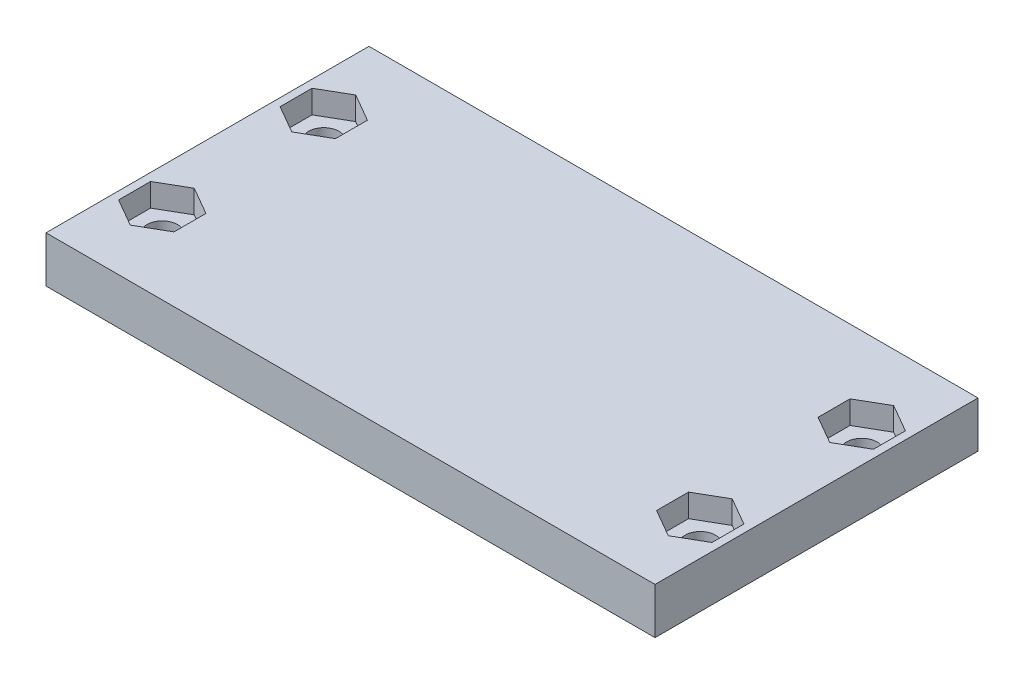
ISO-10303-21;
HEADER;
FILE_DESCRIPTION(('STEP AP214'),'2;1');
FILE_NAME('part.step','',(''),(''),'','','');
FILE_SCHEMA(('AUTOMOTIVE_DESIGN { 1 0 10303 214 1 1 1 1 }'));
ENDSEC;
DATA;
#1=APPLICATION_CONTEXT('core data for automotive mechanical design processes');
#2=APPLICATION_PROTOCOL_DEFINITION('international standard','automotive_design',2000,#1);
#3=PRODUCT_CONTEXT('',#1,'mechanical');
#4=PRODUCT('Part','Part','',(#3));
#5=PRODUCT_RELATED_PRODUCT_CATEGORY('part','',(#4));
#6=PRODUCT_DEFINITION_FORMATION('','',#4);
#7=PRODUCT_DEFINITION_CONTEXT('part definition',#1,'design');
#8=PRODUCT_DEFINITION('design','',#6,#7);
#9=PRODUCT_DEFINITION_SHAPE('','',#8);
#10=(LENGTH_UNIT() NAMED_UNIT(*) SI_UNIT(.MILLI.,.METRE.));
#11=(NAMED_UNIT(*) PLANE_ANGLE_UNIT() SI_UNIT($,.RADIAN.));
#12=(NAMED_UNIT(*) SI_UNIT($,.STERADIAN.) SOLID_ANGLE_UNIT());
#13=UNCERTAINTY_MEASURE_WITH_UNIT(LENGTH_MEASURE(1.E-05),#10,'distance_accuracy_value','');
#14=(GEOMETRIC_REPRESENTATION_CONTEXT(3) GLOBAL_UNCERTAINTY_ASSIGNED_CONTEXT((#13)) GLOBAL_UNIT_ASSIGNED_CONTEXT((#10,
#11,#12)) REPRESENTATION_CONTEXT('',''));
#15=CARTESIAN_POINT('',(0.,0.,0.));
#16=DIRECTION('',(0.,0.,1.));
#17=DIRECTION('',(1.,0.,0.));
#18=AXIS2_PLACEMENT_3D('',#15,#16,#17);
#19=CARTESIAN_POINT('',(0.,5.,0.));
#20=DIRECTION('',(1.,0.,0.));
#21=DIRECTION('',(0.,0.,-1.));
#22=AXIS2_PLACEMENT_3D('',#19,#20,#21);
#23=PLANE('',#22);
#24=DIRECTION('',(0.,0.,1.));
#25=VECTOR('',#24,1.);
#26=CARTESIAN_POINT('',(0.,0.,0.));
#27=LINE('',#26,#25);
#28=CARTESIAN_POINT('',(0.,0.,-35.));
#29=VERTEX_POINT('',#28);
#30=CARTESIAN_POINT('',(0.,0.,0.));
#31=VERTEX_POINT('',#30);
#32=EDGE_CURVE('E409',#29,#31,#27,.T.);
#33=ORIENTED_EDGE('',*,*,#32,.T.);
#34=DIRECTION('',(0.,-1.,0.));
#35=VECTOR('',#34,1.);
#36=CARTESIAN_POINT('',(0.,5.,0.));
#37=LINE('',#36,#35);
#38=CARTESIAN_POINT('',(0.,5.,0.));
#39=VERTEX_POINT('',#38);
#40=EDGE_CURVE('E11',#39,#31,#37,.T.);
#41=ORIENTED_EDGE('',*,*,#40,.F.);
#42=DIRECTION('',(0.,0.,1.));
#43=VECTOR('',#42,1.);
#44=CARTESIAN_POINT('',(0.,5.,0.));
#45=LINE('',#44,#43);
#46=CARTESIAN_POINT('',(0.,5.,-35.));
#47=VERTEX_POINT('',#46);
#48=EDGE_CURVE('E420',#47,#39,#45,.T.);
#49=ORIENTED_EDGE('',*,*,#48,.F.);
#50=DIRECTION('',(0.,-1.,0.));
#51=VECTOR('',#50,1.);
#52=CARTESIAN_POINT('',(0.,5.,-35.));
#53=LINE('',#52,#51);
#54=EDGE_CURVE('E430',#47,#29,#53,.T.);
#55=ORIENTED_EDGE('',*,*,#54,.T.);
#56=EDGE_LOOP('',(#33,#41,#49,#55));
#57=FACE_BOUND('',#56,.T.);
#58=ADVANCED_FACE('F32',(#57),#23,.F.);
#59=CARTESIAN_POINT('',(0.,5.,0.));
#60=DIRECTION('',(0.,0.,-1.));
#61=DIRECTION('',(-1.,0.,0.));
#62=AXIS2_PLACEMENT_3D('',#59,#60,#61);
#63=PLANE('',#62);
#64=DIRECTION('',(1.,0.,0.));
#65=VECTOR('',#64,1.);
#66=CARTESIAN_POINT('',(0.,0.,0.));
#67=LINE('',#66,#65);
#68=CARTESIAN_POINT('',(66.,0.,0.));
#69=VERTEX_POINT('',#68);
#70=EDGE_CURVE('E433',#31,#69,#67,.T.);
#71=ORIENTED_EDGE('',*,*,#70,.T.);
#72=DIRECTION('',(0.,-1.,0.));
#73=VECTOR('',#72,1.);
#74=CARTESIAN_POINT('',(66.,5.,0.));
#75=LINE('',#74,#73);
#76=CARTESIAN_POINT('',(66.,5.,0.));
#77=VERTEX_POINT('',#76);
#78=EDGE_CURVE('E40',#77,#69,#75,.T.);
#79=ORIENTED_EDGE('',*,*,#78,.F.);
#80=DIRECTION('',(1.,0.,0.));
#81=VECTOR('',#80,1.);
#82=CARTESIAN_POINT('',(0.,5.,0.));
#83=LINE('',#82,#81);
#84=EDGE_CURVE('E423',#39,#77,#83,.T.);
#85=ORIENTED_EDGE('',*,*,#84,.F.);
#86=ORIENTED_EDGE('',*,*,#40,.T.);
#87=EDGE_LOOP('',(#71,#79,#85,#86));
#88=FACE_BOUND('',#87,.T.);
#89=ADVANCED_FACE('F474',(#88),#63,.F.);
#90=CARTESIAN_POINT('',(66.,5.,0.));
#91=DIRECTION('',(-1.,0.,0.));
#92=DIRECTION('',(0.,0.,1.));
#93=AXIS2_PLACEMENT_3D('',#90,#91,#92);
#94=PLANE('',#93);
#95=DIRECTION('',(0.,0.,-1.));
#96=VECTOR('',#95,1.);
#97=CARTESIAN_POINT('',(66.,0.,0.));
#98=LINE('',#97,#96);
#99=CARTESIAN_POINT('',(66.,0.,-35.));
#100=VERTEX_POINT('',#99);
#101=EDGE_CURVE('E435',#69,#100,#98,.T.);
#102=ORIENTED_EDGE('',*,*,#101,.T.);
#103=DIRECTION('',(0.,-1.,0.));
#104=VECTOR('',#103,1.);
#105=CARTESIAN_POINT('',(66.,5.,-35.));
#106=LINE('',#105,#104);
#107=CARTESIAN_POINT('',(66.,5.,-35.));
#108=VERTEX_POINT('',#107);
#109=EDGE_CURVE('E440',#108,#100,#106,.T.);
#110=ORIENTED_EDGE('',*,*,#109,.F.);
#111=DIRECTION('',(0.,0.,-1.));
#112=VECTOR('',#111,1.);
#113=CARTESIAN_POINT('',(66.,5.,0.));
#114=LINE('',#113,#112);
#115=EDGE_CURVE('E426',#77,#108,#114,.T.);
#116=ORIENTED_EDGE('',*,*,#115,.F.);
#117=ORIENTED_EDGE('',*,*,#78,.T.);
#118=EDGE_LOOP('',(#102,#110,#116,#117));
#119=FACE_BOUND('',#118,.T.);
#120=ADVANCED_FACE('F479',(#119),#94,.F.);
#121=CARTESIAN_POINT('',(0.,5.,-35.));
#122=DIRECTION('',(0.,0.,1.));
#123=DIRECTION('',(1.,0.,0.));
#124=AXIS2_PLACEMENT_3D('',#121,#122,#123);
#125=PLANE('',#124);
#126=DIRECTION('',(-1.,0.,0.));
#127=VECTOR('',#126,1.);
#128=CARTESIAN_POINT('',(0.,0.,-35.));
#129=LINE('',#128,#127);
#130=EDGE_CURVE('E424',#100,#29,#129,.T.);
#131=ORIENTED_EDGE('',*,*,#130,.T.);
#132=ORIENTED_EDGE('',*,*,#54,.F.);
#133=DIRECTION('',(-1.,0.,0.));
#134=VECTOR('',#133,1.);
#135=CARTESIAN_POINT('',(0.,5.,-35.));
#136=LINE('',#135,#134);
#137=EDGE_CURVE('E428',#108,#47,#136,.T.);
#138=ORIENTED_EDGE('',*,*,#137,.F.);
#139=ORIENTED_EDGE('',*,*,#109,.T.);
#140=EDGE_LOOP('',(#131,#132,#138,#139));
#141=FACE_BOUND('',#140,.T.);
#142=ADVANCED_FACE('F496',(#141),#125,.F.);
#143=CARTESIAN_POINT('',(0.,5.,0.));
#144=DIRECTION('',(0.,-1.,0.));
#145=DIRECTION('',(0.,0.,-1.));
#146=AXIS2_PLACEMENT_3D('',#143,#144,#145);
#147=PLANE('',#146);
#148=DIRECTION('',(0.866025403784439,0.,0.5));
#149=VECTOR('',#148,1.);
#150=CARTESIAN_POINT('',(62.15,5.,-22.7858983848623));
#151=LINE('',#150,#149);
#152=CARTESIAN_POINT('',(59.15,5.,-24.5179491924311));
#153=VERTEX_POINT('',#152);
#154=CARTESIAN_POINT('',(62.15,5.,-22.7858983848623));
#155=VERTEX_POINT('',#154);
#156=EDGE_CURVE('E348',#153,#155,#151,.T.);
#157=ORIENTED_EDGE('',*,*,#156,.F.);
#158=DIRECTION('',(0.,0.,1.));
#159=VECTOR('',#158,1.);
#160=CARTESIAN_POINT('',(59.15,5.,-24.5179491924311));
#161=LINE('',#160,#159);
#162=CARTESIAN_POINT('',(59.15,5.,-27.9820508075689));
#163=VERTEX_POINT('',#162);
#164=EDGE_CURVE('E48',#163,#153,#161,.T.);
#165=ORIENTED_EDGE('',*,*,#164,.F.);
#166=DIRECTION('',(-0.866025403784439,0.,0.5));
#167=VECTOR('',#166,1.);
#168=CARTESIAN_POINT('',(59.15,5.,-27.9820508075689));
#169=LINE('',#168,#167);
#170=CARTESIAN_POINT('',(62.15,5.,-29.7141016151378));
#171=VERTEX_POINT('',#170);
#172=EDGE_CURVE('E331',#171,#163,#169,.T.);
#173=ORIENTED_EDGE('',*,*,#172,.F.);
#174=DIRECTION('',(-0.866025403784438,0.,-0.500000000000001));
#175=VECTOR('',#174,1.);
#176=CARTESIAN_POINT('',(62.15,5.,-29.7141016151378));
#177=LINE('',#176,#175);
#178=CARTESIAN_POINT('',(65.15,5.,-27.9820508075689));
#179=VERTEX_POINT('',#178);
#180=EDGE_CURVE('E357',#179,#171,#177,.T.);
#181=ORIENTED_EDGE('',*,*,#180,.F.);
#182=DIRECTION('',(0.,0.,-1.));
#183=VECTOR('',#182,1.);
#184=CARTESIAN_POINT('',(65.15,5.,-27.9820508075689));
#185=LINE('',#184,#183);
#186=CARTESIAN_POINT('',(65.15,5.,-24.5179491924311));
#187=VERTEX_POINT('',#186);
#188=EDGE_CURVE('E354',#187,#179,#185,.T.);
#189=ORIENTED_EDGE('',*,*,#188,.F.);
#190=DIRECTION('',(0.866025403784438,0.,-0.500000000000001));
#191=VECTOR('',#190,1.);
#192=CARTESIAN_POINT('',(65.15,5.,-24.5179491924311));
#193=LINE('',#192,#191);
#194=EDGE_CURVE('E351',#155,#187,#193,.T.);
#195=ORIENTED_EDGE('',*,*,#194,.F.);
#196=EDGE_LOOP('',(#157,#165,#173,#181,#189,#195));
#197=FACE_BOUND('',#196,.T.);
#198=DIRECTION('',(0.866025403784439,0.,-0.5));
#199=VECTOR('',#198,1.);
#200=CARTESIAN_POINT('',(3.85,5.,-5.28589838486225));
#201=LINE('',#200,#199);
#202=CARTESIAN_POINT('',(3.85,5.,-5.28589838486225));
#203=VERTEX_POINT('',#202);
#204=CARTESIAN_POINT('',(6.85,5.,-7.01794919243112));
#205=VERTEX_POINT('',#204);
#206=EDGE_CURVE('E302',#203,#205,#201,.T.);
#207=ORIENTED_EDGE('',*,*,#206,.F.);
#208=DIRECTION('',(0.866025403784438,0.,0.5));
#209=VECTOR('',#208,1.);
#210=CARTESIAN_POINT('',(0.850000000000004,5.,-7.01794919243112));
#211=LINE('',#210,#209);
#212=CARTESIAN_POINT('',(0.850000000000004,5.,-7.01794919243112));
#213=VERTEX_POINT('',#212);
#214=EDGE_CURVE('E56',#213,#203,#211,.T.);
#215=ORIENTED_EDGE('',*,*,#214,.F.);
#216=DIRECTION('',(0.,0.,1.));
#217=VECTOR('',#216,1.);
#218=CARTESIAN_POINT('',(0.850000000000004,5.,-10.4820508075689));
#219=LINE('',#218,#217);
#220=CARTESIAN_POINT('',(0.850000000000004,5.,-10.4820508075689));
#221=VERTEX_POINT('',#220);
#222=EDGE_CURVE('E285',#221,#213,#219,.T.);
#223=ORIENTED_EDGE('',*,*,#222,.F.);
#224=DIRECTION('',(-0.866025403784439,0.,0.5));
#225=VECTOR('',#224,1.);
#226=CARTESIAN_POINT('',(3.85,5.,-12.2141016151378));
#227=LINE('',#226,#225);
#228=CARTESIAN_POINT('',(3.85,5.,-12.2141016151378));
#229=VERTEX_POINT('',#228);
#230=EDGE_CURVE('E312',#229,#221,#227,.T.);
#231=ORIENTED_EDGE('',*,*,#230,.F.);
#232=DIRECTION('',(-0.866025403784439,0.,-0.5));
#233=VECTOR('',#232,1.);
#234=CARTESIAN_POINT('',(6.85,5.,-10.4820508075689));
#235=LINE('',#234,#233);
#236=CARTESIAN_POINT('',(6.85,5.,-10.4820508075689));
#237=VERTEX_POINT('',#236);
#238=EDGE_CURVE('E309',#237,#229,#235,.T.);
#239=ORIENTED_EDGE('',*,*,#238,.F.);
#240=DIRECTION('',(0.,0.,-1.));
#241=VECTOR('',#240,1.);
#242=CARTESIAN_POINT('',(6.85,5.,-7.01794919243112));
#243=LINE('',#242,#241);
#244=EDGE_CURVE('E306',#205,#237,#243,.T.);
#245=ORIENTED_EDGE('',*,*,#244,.F.);
#246=EDGE_LOOP('',(#207,#215,#223,#231,#239,#245));
#247=FACE_BOUND('',#246,.T.);
#248=DIRECTION('',(-0.866025403784438,0.,0.5));
#249=VECTOR('',#248,1.);
#250=CARTESIAN_POINT('',(3.84999999999999,5.,-29.7141016151378));
#251=LINE('',#250,#249);
#252=CARTESIAN_POINT('',(3.84999999999999,5.,-29.7141016151378));
#253=VERTEX_POINT('',#252);
#254=CARTESIAN_POINT('',(0.85,5.,-27.9820508075689));
#255=VERTEX_POINT('',#254);
#256=EDGE_CURVE('E260',#253,#255,#251,.T.);
#257=ORIENTED_EDGE('',*,*,#256,.F.);
#258=DIRECTION('',(-0.866025403784439,0.,-0.5));
#259=VECTOR('',#258,1.);
#260=CARTESIAN_POINT('',(6.85,5.,-27.9820508075689));
#261=LINE('',#260,#259);
#262=CARTESIAN_POINT('',(6.85,5.,-27.9820508075689));
#263=VERTEX_POINT('',#262);
#264=EDGE_CURVE('E225',#263,#253,#261,.T.);
#265=ORIENTED_EDGE('',*,*,#264,.F.);
#266=DIRECTION('',(0.,0.,-1.));
#267=VECTOR('',#266,1.);
#268=CARTESIAN_POINT('',(6.85,5.,-24.5179491924311));
#269=LINE('',#268,#267);
#270=CARTESIAN_POINT('',(6.85,5.,-24.5179491924311));
#271=VERTEX_POINT('',#270);
#272=EDGE_CURVE('E243',#271,#263,#269,.T.);
#273=ORIENTED_EDGE('',*,*,#272,.F.);
#274=DIRECTION('',(0.866025403784438,0.,-0.500000000000001));
#275=VECTOR('',#274,1.);
#276=CARTESIAN_POINT('',(3.85,5.,-22.7858983848623));
#277=LINE('',#276,#275);
#278=CARTESIAN_POINT('',(3.85,5.,-22.7858983848623));
#279=VERTEX_POINT('',#278);
#280=EDGE_CURVE('E246',#279,#271,#277,.T.);
#281=ORIENTED_EDGE('',*,*,#280,.F.);
#282=DIRECTION('',(0.866025403784439,0.,0.5));
#283=VECTOR('',#282,1.);
#284=CARTESIAN_POINT('',(0.850000000000001,5.,-24.5179491924311));
#285=LINE('',#284,#283);
#286=CARTESIAN_POINT('',(0.850000000000001,5.,-24.5179491924311));
#287=VERTEX_POINT('',#286);
#288=EDGE_CURVE('E266',#287,#279,#285,.T.);
#289=ORIENTED_EDGE('',*,*,#288,.F.);
#290=DIRECTION('',(0.,0.,1.));
#291=VECTOR('',#290,1.);
#292=CARTESIAN_POINT('',(0.85,5.,-27.9820508075689));
#293=LINE('',#292,#291);
#294=EDGE_CURVE('E263',#255,#287,#293,.T.);
#295=ORIENTED_EDGE('',*,*,#294,.F.);
#296=EDGE_LOOP('',(#257,#265,#273,#281,#289,#295));
#297=FACE_BOUND('',#296,.T.);
#298=DIRECTION('',(-0.866025403784438,0.,-0.500000000000001));
#299=VECTOR('',#298,1.);
#300=CARTESIAN_POINT('',(62.15,5.,-12.2141016151378));
#301=LINE('',#300,#299);
#302=CARTESIAN_POINT('',(65.15,5.,-10.4820508075689));
#303=VERTEX_POINT('',#302);
#304=CARTESIAN_POINT('',(62.15,5.,-12.2141016151378));
#305=VERTEX_POINT('',#304);
#306=EDGE_CURVE('E393',#303,#305,#301,.T.);
#307=ORIENTED_EDGE('',*,*,#306,.F.);
#308=DIRECTION('',(0.,0.,-1.));
#309=VECTOR('',#308,1.);
#310=CARTESIAN_POINT('',(65.15,5.,-10.4820508075689));
#311=LINE('',#310,#309);
#312=CARTESIAN_POINT('',(65.15,5.,-7.01794919243113));
#313=VERTEX_POINT('',#312);
#314=EDGE_CURVE('E273',#313,#303,#311,.T.);
#315=ORIENTED_EDGE('',*,*,#314,.F.);
#316=DIRECTION('',(0.866025403784438,0.,-0.500000000000002));
#317=VECTOR('',#316,1.);
#318=CARTESIAN_POINT('',(65.15,5.,-7.01794919243113));
#319=LINE('',#318,#317);
#320=CARTESIAN_POINT('',(62.15,5.,-5.28589838486225));
#321=VERTEX_POINT('',#320);
#322=EDGE_CURVE('E376',#321,#313,#319,.T.);
#323=ORIENTED_EDGE('',*,*,#322,.F.);
#324=DIRECTION('',(0.866025403784439,0.,0.5));
#325=VECTOR('',#324,1.);
#326=CARTESIAN_POINT('',(62.15,5.,-5.28589838486225));
#327=LINE('',#326,#325);
#328=CARTESIAN_POINT('',(59.15,5.,-7.01794919243113));
#329=VERTEX_POINT('',#328);
#330=EDGE_CURVE('E402',#329,#321,#327,.T.);
#331=ORIENTED_EDGE('',*,*,#330,.F.);
#332=DIRECTION('',(0.,0.,1.));
#333=VECTOR('',#332,1.);
#334=CARTESIAN_POINT('',(59.15,5.,-7.01794919243113));
#335=LINE('',#334,#333);
#336=CARTESIAN_POINT('',(59.15,5.,-10.4820508075689));
#337=VERTEX_POINT('',#336);
#338=EDGE_CURVE('E399',#337,#329,#335,.T.);
#339=ORIENTED_EDGE('',*,*,#338,.F.);
#340=DIRECTION('',(-0.866025403784439,0.,0.499999999999999));
#341=VECTOR('',#340,1.);
#342=CARTESIAN_POINT('',(59.15,5.,-10.4820508075689));
#343=LINE('',#342,#341);
#344=EDGE_CURVE('E396',#305,#337,#343,.T.);
#345=ORIENTED_EDGE('',*,*,#344,.F.);
#346=EDGE_LOOP('',(#307,#315,#323,#331,#339,#345));
#347=FACE_BOUND('',#346,.T.);
#348=ORIENTED_EDGE('',*,*,#48,.T.);
#349=ORIENTED_EDGE('',*,*,#84,.T.);
#350=ORIENTED_EDGE('',*,*,#115,.T.);
#351=ORIENTED_EDGE('',*,*,#137,.T.);
#352=EDGE_LOOP('',(#348,#349,#350,#351));
#353=FACE_BOUND('',#352,.T.);
#354=ADVANCED_FACE('F492',(#197,#247,#297,#347,#353),#147,.F.);
#355=CARTESIAN_POINT('',(0.,0.,0.));
#356=DIRECTION('',(0.,-1.,0.));
#357=DIRECTION('',(0.,0.,-1.));
#358=AXIS2_PLACEMENT_3D('',#355,#356,#357);
#359=PLANE('',#358);
#360=CARTESIAN_POINT('',(62.15,0.,-8.75));
#361=DIRECTION('',(0.,1.,0.));
#362=DIRECTION('',(0.,0.,1.));
#363=AXIS2_PLACEMENT_3D('',#360,#361,#362);
#364=CIRCLE('',#363,1.65000000000001);
#365=CARTESIAN_POINT('',(62.15,0.,-7.09999999999999));
#366=VERTEX_POINT('',#365);
#367=EDGE_CURVE('E632',#366,#366,#364,.T.);
#368=ORIENTED_EDGE('',*,*,#367,.T.);
#369=EDGE_LOOP('',(#368));
#370=FACE_BOUND('',#369,.T.);
#371=CARTESIAN_POINT('',(62.15,0.,-26.25));
#372=DIRECTION('',(0.,1.,0.));
#373=DIRECTION('',(0.,0.,1.));
#374=AXIS2_PLACEMENT_3D('',#371,#372,#373);
#375=CIRCLE('',#374,1.65000000000001);
#376=CARTESIAN_POINT('',(62.15,0.,-24.6));
#377=VERTEX_POINT('',#376);
#378=EDGE_CURVE('E627',#377,#377,#375,.T.);
#379=ORIENTED_EDGE('',*,*,#378,.T.);
#380=EDGE_LOOP('',(#379));
#381=FACE_BOUND('',#380,.T.);
#382=CARTESIAN_POINT('',(3.85,0.,-26.25));
#383=DIRECTION('',(0.,1.,0.));
#384=DIRECTION('',(0.,0.,1.));
#385=AXIS2_PLACEMENT_3D('',#382,#383,#384);
#386=CIRCLE('',#385,1.65);
#387=CARTESIAN_POINT('',(3.85,0.,-24.6));
#388=VERTEX_POINT('',#387);
#389=EDGE_CURVE('E625',#388,#388,#386,.T.);
#390=ORIENTED_EDGE('',*,*,#389,.T.);
#391=EDGE_LOOP('',(#390));
#392=FACE_BOUND('',#391,.T.);
#393=CARTESIAN_POINT('',(3.85,0.,-8.75));
#394=DIRECTION('',(0.,1.,0.));
#395=DIRECTION('',(0.,0.,1.));
#396=AXIS2_PLACEMENT_3D('',#393,#394,#395);
#397=CIRCLE('',#396,1.65);
#398=CARTESIAN_POINT('',(3.85,0.,-7.1));
#399=VERTEX_POINT('',#398);
#400=EDGE_CURVE('E249',#399,#399,#397,.T.);
#401=ORIENTED_EDGE('',*,*,#400,.T.);
#402=EDGE_LOOP('',(#401));
#403=FACE_BOUND('',#402,.T.);
#404=ORIENTED_EDGE('',*,*,#32,.F.);
#405=ORIENTED_EDGE('',*,*,#130,.F.);
#406=ORIENTED_EDGE('',*,*,#101,.F.);
#407=ORIENTED_EDGE('',*,*,#70,.F.);
#408=EDGE_LOOP('',(#404,#405,#406,#407));
#409=FACE_BOUND('',#408,.T.);
#410=ADVANCED_FACE('F487',(#370,#381,#392,#403,#409),#359,.T.);
#411=CARTESIAN_POINT('',(65.15,2.5,-10.4820508075689));
#412=DIRECTION('',(1.,0.,0.));
#413=DIRECTION('',(0.,0.,-1.));
#414=AXIS2_PLACEMENT_3D('',#411,#412,#413);
#415=PLANE('',#414);
#416=ORIENTED_EDGE('',*,*,#314,.T.);
#417=DIRECTION('',(0.,1.,0.));
#418=VECTOR('',#417,1.);
#419=CARTESIAN_POINT('',(65.15,2.5,-10.4820508075689));
#420=LINE('',#419,#418);
#421=CARTESIAN_POINT('',(65.15,2.5,-10.4820508075689));
#422=VERTEX_POINT('',#421);
#423=EDGE_CURVE('E391',#422,#303,#420,.T.);
#424=ORIENTED_EDGE('',*,*,#423,.F.);
#425=DIRECTION('',(0.,0.,-1.));
#426=VECTOR('',#425,1.);
#427=CARTESIAN_POINT('',(65.15,2.5,-10.4820508075689));
#428=LINE('',#427,#426);
#429=CARTESIAN_POINT('',(65.15,2.5,-7.01794919243113));
#430=VERTEX_POINT('',#429);
#431=EDGE_CURVE('E372',#430,#422,#428,.T.);
#432=ORIENTED_EDGE('',*,*,#431,.F.);
#433=DIRECTION('',(0.,1.,0.));
#434=VECTOR('',#433,1.);
#435=CARTESIAN_POINT('',(65.15,2.5,-7.01794919243113));
#436=LINE('',#435,#434);
#437=EDGE_CURVE('E407',#430,#313,#436,.T.);
#438=ORIENTED_EDGE('',*,*,#437,.T.);
#439=EDGE_LOOP('',(#416,#424,#432,#438));
#440=FACE_BOUND('',#439,.T.);
#441=ADVANCED_FACE('F507',(#440),#415,.F.);
#442=CARTESIAN_POINT('',(65.15,2.5,-7.01794919243113));
#443=DIRECTION('',(0.500000000000002,0.,0.866025403784438));
#444=DIRECTION('',(0.866025403784438,0.,-0.500000000000002));
#445=AXIS2_PLACEMENT_3D('',#442,#443,#444);
#446=PLANE('',#445);
#447=ORIENTED_EDGE('',*,*,#322,.T.);
#448=ORIENTED_EDGE('',*,*,#437,.F.);
#449=DIRECTION('',(0.866025403784438,0.,-0.500000000000002));
#450=VECTOR('',#449,1.);
#451=CARTESIAN_POINT('',(65.15,2.5,-7.01794919243113));
#452=LINE('',#451,#450);
#453=CARTESIAN_POINT('',(62.15,2.5,-5.28589838486225));
#454=VERTEX_POINT('',#453);
#455=EDGE_CURVE('E388',#454,#430,#452,.T.);
#456=ORIENTED_EDGE('',*,*,#455,.F.);
#457=DIRECTION('',(0.,1.,0.));
#458=VECTOR('',#457,1.);
#459=CARTESIAN_POINT('',(62.15,2.5,-5.28589838486225));
#460=LINE('',#459,#458);
#461=EDGE_CURVE('E410',#454,#321,#460,.T.);
#462=ORIENTED_EDGE('',*,*,#461,.T.);
#463=EDGE_LOOP('',(#447,#448,#456,#462));
#464=FACE_BOUND('',#463,.T.);
#465=ADVANCED_FACE('F514',(#464),#446,.F.);
#466=CARTESIAN_POINT('',(62.15,2.5,-5.28589838486225));
#467=DIRECTION('',(-0.5,0.,0.866025403784439));
#468=DIRECTION('',(0.866025403784439,0.,0.5));
#469=AXIS2_PLACEMENT_3D('',#466,#467,#468);
#470=PLANE('',#469);
#471=ORIENTED_EDGE('',*,*,#330,.T.);
#472=ORIENTED_EDGE('',*,*,#461,.F.);
#473=DIRECTION('',(0.866025403784439,0.,0.5));
#474=VECTOR('',#473,1.);
#475=CARTESIAN_POINT('',(62.15,2.5,-5.28589838486225));
#476=LINE('',#475,#474);
#477=CARTESIAN_POINT('',(59.15,2.5,-7.01794919243113));
#478=VERTEX_POINT('',#477);
#479=EDGE_CURVE('E385',#478,#454,#476,.T.);
#480=ORIENTED_EDGE('',*,*,#479,.F.);
#481=DIRECTION('',(0.,1.,0.));
#482=VECTOR('',#481,1.);
#483=CARTESIAN_POINT('',(59.15,2.5,-7.01794919243113));
#484=LINE('',#483,#482);
#485=EDGE_CURVE('E412',#478,#329,#484,.T.);
#486=ORIENTED_EDGE('',*,*,#485,.T.);
#487=EDGE_LOOP('',(#471,#472,#480,#486));
#488=FACE_BOUND('',#487,.T.);
#489=ADVANCED_FACE('F527',(#488),#470,.F.);
#490=CARTESIAN_POINT('',(59.15,2.5,-7.01794919243113));
#491=DIRECTION('',(-1.,0.,0.));
#492=DIRECTION('',(0.,0.,1.));
#493=AXIS2_PLACEMENT_3D('',#490,#491,#492);
#494=PLANE('',#493);
#495=ORIENTED_EDGE('',*,*,#338,.T.);
#496=ORIENTED_EDGE('',*,*,#485,.F.);
#497=DIRECTION('',(0.,0.,1.));
#498=VECTOR('',#497,1.);
#499=CARTESIAN_POINT('',(59.15,2.5,-7.01794919243113));
#500=LINE('',#499,#498);
#501=CARTESIAN_POINT('',(59.15,2.5,-10.4820508075689));
#502=VERTEX_POINT('',#501);
#503=EDGE_CURVE('E382',#502,#478,#500,.T.);
#504=ORIENTED_EDGE('',*,*,#503,.F.);
#505=DIRECTION('',(0.,1.,0.));
#506=VECTOR('',#505,1.);
#507=CARTESIAN_POINT('',(59.15,2.5,-10.4820508075689));
#508=LINE('',#507,#506);
#509=EDGE_CURVE('E414',#502,#337,#508,.T.);
#510=ORIENTED_EDGE('',*,*,#509,.T.);
#511=EDGE_LOOP('',(#495,#496,#504,#510));
#512=FACE_BOUND('',#511,.T.);
#513=ADVANCED_FACE('F523',(#512),#494,.F.);
#514=CARTESIAN_POINT('',(59.15,2.5,-10.4820508075689));
#515=DIRECTION('',(-0.499999999999999,0.,-0.866025403784439));
#516=DIRECTION('',(-0.866025403784439,0.,0.499999999999999));
#517=AXIS2_PLACEMENT_3D('',#514,#515,#516);
#518=PLANE('',#517);
#519=ORIENTED_EDGE('',*,*,#344,.T.);
#520=ORIENTED_EDGE('',*,*,#509,.F.);
#521=DIRECTION('',(-0.866025403784439,0.,0.499999999999999));
#522=VECTOR('',#521,1.);
#523=CARTESIAN_POINT('',(59.15,2.5,-10.4820508075689));
#524=LINE('',#523,#522);
#525=CARTESIAN_POINT('',(62.15,2.5,-12.2141016151378));
#526=VERTEX_POINT('',#525);
#527=EDGE_CURVE('E379',#526,#502,#524,.T.);
#528=ORIENTED_EDGE('',*,*,#527,.F.);
#529=DIRECTION('',(0.,1.,0.));
#530=VECTOR('',#529,1.);
#531=CARTESIAN_POINT('',(62.15,2.5,-12.2141016151378));
#532=LINE('',#531,#530);
#533=EDGE_CURVE('E416',#526,#305,#532,.T.);
#534=ORIENTED_EDGE('',*,*,#533,.T.);
#535=EDGE_LOOP('',(#519,#520,#528,#534));
#536=FACE_BOUND('',#535,.T.);
#537=ADVANCED_FACE('F519',(#536),#518,.F.);
#538=CARTESIAN_POINT('',(62.15,2.5,-12.2141016151378));
#539=DIRECTION('',(0.500000000000001,0.,-0.866025403784438));
#540=DIRECTION('',(-0.866025403784438,0.,-0.500000000000001));
#541=AXIS2_PLACEMENT_3D('',#538,#539,#540);
#542=PLANE('',#541);
#543=ORIENTED_EDGE('',*,*,#306,.T.);
#544=ORIENTED_EDGE('',*,*,#533,.F.);
#545=DIRECTION('',(-0.866025403784438,0.,-0.500000000000001));
#546=VECTOR('',#545,1.);
#547=CARTESIAN_POINT('',(62.15,2.5,-12.2141016151378));
#548=LINE('',#547,#546);
#549=EDGE_CURVE('E375',#422,#526,#548,.T.);
#550=ORIENTED_EDGE('',*,*,#549,.F.);
#551=ORIENTED_EDGE('',*,*,#423,.T.);
#552=EDGE_LOOP('',(#543,#544,#550,#551));
#553=FACE_BOUND('',#552,.T.);
#554=ADVANCED_FACE('F516',(#553),#542,.F.);
#555=CARTESIAN_POINT('',(0.,2.5,0.));
#556=DIRECTION('',(0.,-1.,0.));
#557=DIRECTION('',(0.,0.,-1.));
#558=AXIS2_PLACEMENT_3D('',#555,#556,#557);
#559=PLANE('',#558);
#560=CARTESIAN_POINT('',(62.15,2.5,-8.75));
#561=DIRECTION('',(0.,-1.,0.));
#562=DIRECTION('',(0.,0.,-1.));
#563=AXIS2_PLACEMENT_3D('',#560,#561,#562);
#564=CIRCLE('',#563,1.65000000000001);
#565=CARTESIAN_POINT('',(62.15,2.5,-10.4));
#566=VERTEX_POINT('',#565);
#567=EDGE_CURVE('E35',#566,#566,#564,.T.);
#568=ORIENTED_EDGE('',*,*,#567,.T.);
#569=EDGE_LOOP('',(#568));
#570=FACE_BOUND('',#569,.T.);
#571=ORIENTED_EDGE('',*,*,#431,.T.);
#572=ORIENTED_EDGE('',*,*,#549,.T.);
#573=ORIENTED_EDGE('',*,*,#527,.T.);
#574=ORIENTED_EDGE('',*,*,#503,.T.);
#575=ORIENTED_EDGE('',*,*,#479,.T.);
#576=ORIENTED_EDGE('',*,*,#455,.T.);
#577=EDGE_LOOP('',(#571,#572,#573,#574,#575,#576));
#578=FACE_BOUND('',#577,.T.);
#579=ADVANCED_FACE('F457',(#570,#578),#559,.F.);
#580=CARTESIAN_POINT('',(6.85,2.5,-27.9820508075689));
#581=DIRECTION('',(0.5,0.,-0.866025403784439));
#582=DIRECTION('',(-0.866025403784439,0.,-0.5));
#583=AXIS2_PLACEMENT_3D('',#580,#581,#582);
#584=PLANE('',#583);
#585=ORIENTED_EDGE('',*,*,#264,.T.);
#586=DIRECTION('',(0.,1.,0.));
#587=VECTOR('',#586,1.);
#588=CARTESIAN_POINT('',(3.84999999999999,2.5,-29.7141016151378));
#589=LINE('',#588,#587);
#590=CARTESIAN_POINT('',(3.84999999999999,2.5,-29.7141016151378));
#591=VERTEX_POINT('',#590);
#592=EDGE_CURVE('E218',#591,#253,#589,.T.);
#593=ORIENTED_EDGE('',*,*,#592,.F.);
#594=DIRECTION('',(-0.866025403784439,0.,-0.5));
#595=VECTOR('',#594,1.);
#596=CARTESIAN_POINT('',(6.85,2.5,-27.9820508075689));
#597=LINE('',#596,#595);
#598=CARTESIAN_POINT('',(6.85,2.5,-27.9820508075689));
#599=VERTEX_POINT('',#598);
#600=EDGE_CURVE('E222',#599,#591,#597,.T.);
#601=ORIENTED_EDGE('',*,*,#600,.F.);
#602=DIRECTION('',(0.,1.,0.));
#603=VECTOR('',#602,1.);
#604=CARTESIAN_POINT('',(6.85,2.5,-27.9820508075689));
#605=LINE('',#604,#603);
#606=EDGE_CURVE('E271',#599,#263,#605,.T.);
#607=ORIENTED_EDGE('',*,*,#606,.T.);
#608=EDGE_LOOP('',(#585,#593,#601,#607));
#609=FACE_BOUND('',#608,.T.);
#610=ADVANCED_FACE('F220',(#609),#584,.F.);
#611=CARTESIAN_POINT('',(6.85,2.5,-24.5179491924311));
#612=DIRECTION('',(1.,0.,0.));
#613=DIRECTION('',(0.,0.,-1.));
#614=AXIS2_PLACEMENT_3D('',#611,#612,#613);
#615=PLANE('',#614);
#616=ORIENTED_EDGE('',*,*,#272,.T.);
#617=ORIENTED_EDGE('',*,*,#606,.F.);
#618=DIRECTION('',(0.,0.,-1.));
#619=VECTOR('',#618,1.);
#620=CARTESIAN_POINT('',(6.85,2.5,-24.5179491924311));
#621=LINE('',#620,#619);
#622=CARTESIAN_POINT('',(6.85,2.5,-24.5179491924311));
#623=VERTEX_POINT('',#622);
#624=EDGE_CURVE('E230',#623,#599,#621,.T.);
#625=ORIENTED_EDGE('',*,*,#624,.F.);
#626=DIRECTION('',(0.,1.,0.));
#627=VECTOR('',#626,1.);
#628=CARTESIAN_POINT('',(6.85,2.5,-24.5179491924311));
#629=LINE('',#628,#627);
#630=EDGE_CURVE('E274',#623,#271,#629,.T.);
#631=ORIENTED_EDGE('',*,*,#630,.T.);
#632=EDGE_LOOP('',(#616,#617,#625,#631));
#633=FACE_BOUND('',#632,.T.);
#634=ADVANCED_FACE('F594',(#633),#615,.F.);
#635=CARTESIAN_POINT('',(3.85,2.5,-22.7858983848623));
#636=DIRECTION('',(0.500000000000001,0.,0.866025403784438));
#637=DIRECTION('',(0.866025403784438,0.,-0.500000000000001));
#638=AXIS2_PLACEMENT_3D('',#635,#636,#637);
#639=PLANE('',#638);
#640=ORIENTED_EDGE('',*,*,#280,.T.);
#641=ORIENTED_EDGE('',*,*,#630,.F.);
#642=DIRECTION('',(0.866025403784438,0.,-0.500000000000001));
#643=VECTOR('',#642,1.);
#644=CARTESIAN_POINT('',(3.85,2.5,-22.7858983848623));
#645=LINE('',#644,#643);
#646=CARTESIAN_POINT('',(3.85,2.5,-22.7858983848623));
#647=VERTEX_POINT('',#646);
#648=EDGE_CURVE('E256',#647,#623,#645,.T.);
#649=ORIENTED_EDGE('',*,*,#648,.F.);
#650=DIRECTION('',(0.,1.,0.));
#651=VECTOR('',#650,1.);
#652=CARTESIAN_POINT('',(3.85,2.5,-22.7858983848623));
#653=LINE('',#652,#651);
#654=EDGE_CURVE('E276',#647,#279,#653,.T.);
#655=ORIENTED_EDGE('',*,*,#654,.T.);
#656=EDGE_LOOP('',(#640,#641,#649,#655));
#657=FACE_BOUND('',#656,.T.);
#658=ADVANCED_FACE('F604',(#657),#639,.F.);
#659=CARTESIAN_POINT('',(0.850000000000001,2.5,-24.5179491924311));
#660=DIRECTION('',(-0.5,0.,0.866025403784439));
#661=DIRECTION('',(0.866025403784439,0.,0.5));
#662=AXIS2_PLACEMENT_3D('',#659,#660,#661);
#663=PLANE('',#662);
#664=ORIENTED_EDGE('',*,*,#288,.T.);
#665=ORIENTED_EDGE('',*,*,#654,.F.);
#666=DIRECTION('',(0.866025403784439,0.,0.5));
#667=VECTOR('',#666,1.);
#668=CARTESIAN_POINT('',(0.850000000000001,2.5,-24.5179491924311));
#669=LINE('',#668,#667);
#670=CARTESIAN_POINT('',(0.850000000000001,2.5,-24.5179491924311));
#671=VERTEX_POINT('',#670);
#672=EDGE_CURVE('E253',#671,#647,#669,.T.);
#673=ORIENTED_EDGE('',*,*,#672,.F.);
#674=DIRECTION('',(0.,1.,0.));
#675=VECTOR('',#674,1.);
#676=CARTESIAN_POINT('',(0.850000000000001,2.5,-24.5179491924311));
#677=LINE('',#676,#675);
#678=EDGE_CURVE('E278',#671,#287,#677,.T.);
#679=ORIENTED_EDGE('',*,*,#678,.T.);
#680=EDGE_LOOP('',(#664,#665,#673,#679));
#681=FACE_BOUND('',#680,.T.);
#682=ADVANCED_FACE('F600',(#681),#663,.F.);
#683=CARTESIAN_POINT('',(0.85,2.5,-27.9820508075689));
#684=DIRECTION('',(-1.,0.,0.));
#685=DIRECTION('',(0.,0.,1.));
#686=AXIS2_PLACEMENT_3D('',#683,#684,#685);
#687=PLANE('',#686);
#688=ORIENTED_EDGE('',*,*,#294,.T.);
#689=ORIENTED_EDGE('',*,*,#678,.F.);
#690=DIRECTION('',(0.,0.,1.));
#691=VECTOR('',#690,1.);
#692=CARTESIAN_POINT('',(0.85,2.5,-27.9820508075689));
#693=LINE('',#692,#691);
#694=CARTESIAN_POINT('',(0.85,2.5,-27.9820508075689));
#695=VERTEX_POINT('',#694);
#696=EDGE_CURVE('E238',#695,#671,#693,.T.);
#697=ORIENTED_EDGE('',*,*,#696,.F.);
#698=DIRECTION('',(0.,1.,0.));
#699=VECTOR('',#698,1.);
#700=CARTESIAN_POINT('',(0.85,2.5,-27.9820508075689));
#701=LINE('',#700,#699);
#702=EDGE_CURVE('E229',#695,#255,#701,.T.);
#703=ORIENTED_EDGE('',*,*,#702,.T.);
#704=EDGE_LOOP('',(#688,#689,#697,#703));
#705=FACE_BOUND('',#704,.T.);
#706=ADVANCED_FACE('F597',(#705),#687,.F.);
#707=CARTESIAN_POINT('',(3.84999999999999,2.5,-29.7141016151378));
#708=DIRECTION('',(-0.5,0.,-0.866025403784438));
#709=DIRECTION('',(-0.866025403784438,0.,0.500000000000001));
#710=AXIS2_PLACEMENT_3D('',#707,#708,#709);
#711=PLANE('',#710);
#712=ORIENTED_EDGE('',*,*,#256,.T.);
#713=ORIENTED_EDGE('',*,*,#702,.F.);
#714=DIRECTION('',(-0.866025403784438,0.,0.5));
#715=VECTOR('',#714,1.);
#716=CARTESIAN_POINT('',(3.84999999999999,2.5,-29.7141016151378));
#717=LINE('',#716,#715);
#718=EDGE_CURVE('E233',#591,#695,#717,.T.);
#719=ORIENTED_EDGE('',*,*,#718,.F.);
#720=ORIENTED_EDGE('',*,*,#592,.T.);
#721=EDGE_LOOP('',(#712,#713,#719,#720));
#722=FACE_BOUND('',#721,.T.);
#723=ADVANCED_FACE('F234',(#722),#711,.F.);
#724=CARTESIAN_POINT('',(0.,2.5,0.));
#725=DIRECTION('',(0.,1.,0.));
#726=DIRECTION('',(0.,0.,1.));
#727=AXIS2_PLACEMENT_3D('',#724,#725,#726);
#728=PLANE('',#727);
#729=CARTESIAN_POINT('',(3.85,2.5,-26.25));
#730=DIRECTION('',(0.,1.,0.));
#731=DIRECTION('',(0.,0.,1.));
#732=AXIS2_PLACEMENT_3D('',#729,#730,#731);
#733=CIRCLE('',#732,1.65);
#734=CARTESIAN_POINT('',(3.85,2.5,-24.6));
#735=VERTEX_POINT('',#734);
#736=EDGE_CURVE('E450',#735,#735,#733,.T.);
#737=ORIENTED_EDGE('',*,*,#736,.F.);
#738=EDGE_LOOP('',(#737));
#739=FACE_BOUND('',#738,.T.);
#740=ORIENTED_EDGE('',*,*,#600,.T.);
#741=ORIENTED_EDGE('',*,*,#718,.T.);
#742=ORIENTED_EDGE('',*,*,#696,.T.);
#743=ORIENTED_EDGE('',*,*,#672,.T.);
#744=ORIENTED_EDGE('',*,*,#648,.T.);
#745=ORIENTED_EDGE('',*,*,#624,.T.);
#746=EDGE_LOOP('',(#740,#741,#742,#743,#744,#745));
#747=FACE_BOUND('',#746,.T.);
#748=ADVANCED_FACE('F240',(#739,#747),#728,.T.);
#749=CARTESIAN_POINT('',(0.850000000000004,2.5,-7.01794919243112));
#750=DIRECTION('',(-0.5,0.,0.866025403784439));
#751=DIRECTION('',(0.866025403784439,0.,0.5));
#752=AXIS2_PLACEMENT_3D('',#749,#750,#751);
#753=PLANE('',#752);
#754=ORIENTED_EDGE('',*,*,#214,.T.);
#755=DIRECTION('',(0.,1.,0.));
#756=VECTOR('',#755,1.);
#757=CARTESIAN_POINT('',(3.85,2.5,-5.28589838486225));
#758=LINE('',#757,#756);
#759=CARTESIAN_POINT('',(3.85,2.5,-5.28589838486225));
#760=VERTEX_POINT('',#759);
#761=EDGE_CURVE('E300',#760,#203,#758,.T.);
#762=ORIENTED_EDGE('',*,*,#761,.F.);
#763=DIRECTION('',(0.866025403784438,0.,0.5));
#764=VECTOR('',#763,1.);
#765=CARTESIAN_POINT('',(0.850000000000004,2.5,-7.01794919243112));
#766=LINE('',#765,#764);
#767=CARTESIAN_POINT('',(0.850000000000004,2.5,-7.01794919243112));
#768=VERTEX_POINT('',#767);
#769=EDGE_CURVE('E281',#768,#760,#766,.T.);
#770=ORIENTED_EDGE('',*,*,#769,.F.);
#771=DIRECTION('',(0.,1.,0.));
#772=VECTOR('',#771,1.);
#773=CARTESIAN_POINT('',(0.850000000000004,2.5,-7.01794919243112));
#774=LINE('',#773,#772);
#775=EDGE_CURVE('E261',#768,#213,#774,.T.);
#776=ORIENTED_EDGE('',*,*,#775,.T.);
#777=EDGE_LOOP('',(#754,#762,#770,#776));
#778=FACE_BOUND('',#777,.T.);
#779=ADVANCED_FACE('F566',(#778),#753,.F.);
#780=CARTESIAN_POINT('',(0.850000000000004,2.5,-10.4820508075689));
#781=DIRECTION('',(-1.,0.,0.));
#782=DIRECTION('',(0.,0.,1.));
#783=AXIS2_PLACEMENT_3D('',#780,#781,#782);
#784=PLANE('',#783);
#785=ORIENTED_EDGE('',*,*,#222,.T.);
#786=ORIENTED_EDGE('',*,*,#775,.F.);
#787=DIRECTION('',(0.,0.,1.));
#788=VECTOR('',#787,1.);
#789=CARTESIAN_POINT('',(0.850000000000004,2.5,-10.4820508075689));
#790=LINE('',#789,#788);
#791=CARTESIAN_POINT('',(0.850000000000004,2.5,-10.4820508075689));
#792=VERTEX_POINT('',#791);
#793=EDGE_CURVE('E297',#792,#768,#790,.T.);
#794=ORIENTED_EDGE('',*,*,#793,.F.);
#795=DIRECTION('',(0.,1.,0.));
#796=VECTOR('',#795,1.);
#797=CARTESIAN_POINT('',(0.850000000000004,2.5,-10.4820508075689));
#798=LINE('',#797,#796);
#799=EDGE_CURVE('E318',#792,#221,#798,.T.);
#800=ORIENTED_EDGE('',*,*,#799,.T.);
#801=EDGE_LOOP('',(#785,#786,#794,#800));
#802=FACE_BOUND('',#801,.T.);
#803=ADVANCED_FACE('F569',(#802),#784,.F.);
#804=CARTESIAN_POINT('',(3.85,2.5,-12.2141016151378));
#805=DIRECTION('',(-0.5,0.,-0.866025403784439));
#806=DIRECTION('',(-0.866025403784439,0.,0.5));
#807=AXIS2_PLACEMENT_3D('',#804,#805,#806);
#808=PLANE('',#807);
#809=ORIENTED_EDGE('',*,*,#230,.T.);
#810=ORIENTED_EDGE('',*,*,#799,.F.);
#811=DIRECTION('',(-0.866025403784439,0.,0.5));
#812=VECTOR('',#811,1.);
#813=CARTESIAN_POINT('',(3.85,2.5,-12.2141016151378));
#814=LINE('',#813,#812);
#815=CARTESIAN_POINT('',(3.85,2.5,-12.2141016151378));
#816=VERTEX_POINT('',#815);
#817=EDGE_CURVE('E294',#816,#792,#814,.T.);
#818=ORIENTED_EDGE('',*,*,#817,.F.);
#819=DIRECTION('',(0.,1.,0.));
#820=VECTOR('',#819,1.);
#821=CARTESIAN_POINT('',(3.85,2.5,-12.2141016151378));
#822=LINE('',#821,#820);
#823=EDGE_CURVE('E320',#816,#229,#822,.T.);
#824=ORIENTED_EDGE('',*,*,#823,.T.);
#825=EDGE_LOOP('',(#809,#810,#818,#824));
#826=FACE_BOUND('',#825,.T.);
#827=ADVANCED_FACE('F581',(#826),#808,.F.);
#828=CARTESIAN_POINT('',(6.85,2.5,-10.4820508075689));
#829=DIRECTION('',(0.5,0.,-0.866025403784439));
#830=DIRECTION('',(-0.866025403784439,0.,-0.5));
#831=AXIS2_PLACEMENT_3D('',#828,#829,#830);
#832=PLANE('',#831);
#833=ORIENTED_EDGE('',*,*,#238,.T.);
#834=ORIENTED_EDGE('',*,*,#823,.F.);
#835=DIRECTION('',(-0.866025403784439,0.,-0.5));
#836=VECTOR('',#835,1.);
#837=CARTESIAN_POINT('',(6.85,2.5,-10.4820508075689));
#838=LINE('',#837,#836);
#839=CARTESIAN_POINT('',(6.85,2.5,-10.4820508075689));
#840=VERTEX_POINT('',#839);
#841=EDGE_CURVE('E291',#840,#816,#838,.T.);
#842=ORIENTED_EDGE('',*,*,#841,.F.);
#843=DIRECTION('',(0.,1.,0.));
#844=VECTOR('',#843,1.);
#845=CARTESIAN_POINT('',(6.85,2.5,-10.4820508075689));
#846=LINE('',#845,#844);
#847=EDGE_CURVE('E322',#840,#237,#846,.T.);
#848=ORIENTED_EDGE('',*,*,#847,.T.);
#849=EDGE_LOOP('',(#833,#834,#842,#848));
#850=FACE_BOUND('',#849,.T.);
#851=ADVANCED_FACE('F577',(#850),#832,.F.);
#852=CARTESIAN_POINT('',(6.85,2.5,-7.01794919243112));
#853=DIRECTION('',(1.,0.,0.));
#854=DIRECTION('',(0.,0.,-1.));
#855=AXIS2_PLACEMENT_3D('',#852,#853,#854);
#856=PLANE('',#855);
#857=ORIENTED_EDGE('',*,*,#244,.T.);
#858=ORIENTED_EDGE('',*,*,#847,.F.);
#859=DIRECTION('',(0.,0.,-1.));
#860=VECTOR('',#859,1.);
#861=CARTESIAN_POINT('',(6.85,2.5,-7.01794919243112));
#862=LINE('',#861,#860);
#863=CARTESIAN_POINT('',(6.85,2.5,-7.01794919243112));
#864=VERTEX_POINT('',#863);
#865=EDGE_CURVE('E288',#864,#840,#862,.T.);
#866=ORIENTED_EDGE('',*,*,#865,.F.);
#867=DIRECTION('',(0.,1.,0.));
#868=VECTOR('',#867,1.);
#869=CARTESIAN_POINT('',(6.85,2.5,-7.01794919243112));
#870=LINE('',#869,#868);
#871=EDGE_CURVE('E324',#864,#205,#870,.T.);
#872=ORIENTED_EDGE('',*,*,#871,.T.);
#873=EDGE_LOOP('',(#857,#858,#866,#872));
#874=FACE_BOUND('',#873,.T.);
#875=ADVANCED_FACE('F573',(#874),#856,.F.);
#876=CARTESIAN_POINT('',(3.85,2.5,-5.28589838486225));
#877=DIRECTION('',(0.5,0.,0.866025403784438));
#878=DIRECTION('',(0.866025403784438,0.,-0.5));
#879=AXIS2_PLACEMENT_3D('',#876,#877,#878);
#880=PLANE('',#879);
#881=ORIENTED_EDGE('',*,*,#206,.T.);
#882=ORIENTED_EDGE('',*,*,#871,.F.);
#883=DIRECTION('',(0.866025403784439,0.,-0.5));
#884=VECTOR('',#883,1.);
#885=CARTESIAN_POINT('',(3.85,2.5,-5.28589838486225));
#886=LINE('',#885,#884);
#887=EDGE_CURVE('E284',#760,#864,#886,.T.);
#888=ORIENTED_EDGE('',*,*,#887,.F.);
#889=ORIENTED_EDGE('',*,*,#761,.T.);
#890=EDGE_LOOP('',(#881,#882,#888,#889));
#891=FACE_BOUND('',#890,.T.);
#892=ADVANCED_FACE('F570',(#891),#880,.F.);
#893=CARTESIAN_POINT('',(0.,2.5,0.));
#894=DIRECTION('',(0.,1.,0.));
#895=DIRECTION('',(0.,0.,1.));
#896=AXIS2_PLACEMENT_3D('',#893,#894,#895);
#897=PLANE('',#896);
#898=CARTESIAN_POINT('',(3.85,2.5,-8.75));
#899=DIRECTION('',(0.,1.,0.));
#900=DIRECTION('',(0.,0.,1.));
#901=AXIS2_PLACEMENT_3D('',#898,#899,#900);
#902=CIRCLE('',#901,1.65);
#903=CARTESIAN_POINT('',(3.85,2.5,-7.1));
#904=VERTEX_POINT('',#903);
#905=EDGE_CURVE('E448',#904,#904,#902,.T.);
#906=ORIENTED_EDGE('',*,*,#905,.F.);
#907=EDGE_LOOP('',(#906));
#908=FACE_BOUND('',#907,.T.);
#909=ORIENTED_EDGE('',*,*,#769,.T.);
#910=ORIENTED_EDGE('',*,*,#887,.T.);
#911=ORIENTED_EDGE('',*,*,#865,.T.);
#912=ORIENTED_EDGE('',*,*,#841,.T.);
#913=ORIENTED_EDGE('',*,*,#817,.T.);
#914=ORIENTED_EDGE('',*,*,#793,.T.);
#915=EDGE_LOOP('',(#909,#910,#911,#912,#913,#914));
#916=FACE_BOUND('',#915,.T.);
#917=ADVANCED_FACE('F541',(#908,#916),#897,.T.);
#918=CARTESIAN_POINT('',(59.15,2.5,-24.5179491924311));
#919=DIRECTION('',(-1.,0.,0.));
#920=DIRECTION('',(0.,0.,1.));
#921=AXIS2_PLACEMENT_3D('',#918,#919,#920);
#922=PLANE('',#921);
#923=ORIENTED_EDGE('',*,*,#164,.T.);
#924=DIRECTION('',(0.,1.,0.));
#925=VECTOR('',#924,1.);
#926=CARTESIAN_POINT('',(59.15,2.5,-24.5179491924311));
#927=LINE('',#926,#925);
#928=CARTESIAN_POINT('',(59.15,2.5,-24.5179491924311));
#929=VERTEX_POINT('',#928);
#930=EDGE_CURVE('E346',#929,#153,#927,.T.);
#931=ORIENTED_EDGE('',*,*,#930,.F.);
#932=DIRECTION('',(0.,0.,1.));
#933=VECTOR('',#932,1.);
#934=CARTESIAN_POINT('',(59.15,2.5,-24.5179491924311));
#935=LINE('',#934,#933);
#936=CARTESIAN_POINT('',(59.15,2.5,-27.9820508075689));
#937=VERTEX_POINT('',#936);
#938=EDGE_CURVE('E327',#937,#929,#935,.T.);
#939=ORIENTED_EDGE('',*,*,#938,.F.);
#940=DIRECTION('',(0.,1.,0.));
#941=VECTOR('',#940,1.);
#942=CARTESIAN_POINT('',(59.15,2.5,-27.9820508075689));
#943=LINE('',#942,#941);
#944=EDGE_CURVE('E303',#937,#163,#943,.T.);
#945=ORIENTED_EDGE('',*,*,#944,.T.);
#946=EDGE_LOOP('',(#923,#931,#939,#945));
#947=FACE_BOUND('',#946,.T.);
#948=ADVANCED_FACE('F537',(#947),#922,.F.);
#949=CARTESIAN_POINT('',(59.15,2.5,-27.9820508075689));
#950=DIRECTION('',(-0.5,0.,-0.866025403784439));
#951=DIRECTION('',(-0.866025403784439,0.,0.5));
#952=AXIS2_PLACEMENT_3D('',#949,#950,#951);
#953=PLANE('',#952);
#954=ORIENTED_EDGE('',*,*,#172,.T.);
#955=ORIENTED_EDGE('',*,*,#944,.F.);
#956=DIRECTION('',(-0.866025403784439,0.,0.5));
#957=VECTOR('',#956,1.);
#958=CARTESIAN_POINT('',(59.15,2.5,-27.9820508075689));
#959=LINE('',#958,#957);
#960=CARTESIAN_POINT('',(62.15,2.5,-29.7141016151378));
#961=VERTEX_POINT('',#960);
#962=EDGE_CURVE('E343',#961,#937,#959,.T.);
#963=ORIENTED_EDGE('',*,*,#962,.F.);
#964=DIRECTION('',(0.,1.,0.));
#965=VECTOR('',#964,1.);
#966=CARTESIAN_POINT('',(62.15,2.5,-29.7141016151378));
#967=LINE('',#966,#965);
#968=EDGE_CURVE('E363',#961,#171,#967,.T.);
#969=ORIENTED_EDGE('',*,*,#968,.T.);
#970=EDGE_LOOP('',(#954,#955,#963,#969));
#971=FACE_BOUND('',#970,.T.);
#972=ADVANCED_FACE('F540',(#971),#953,.F.);
#973=CARTESIAN_POINT('',(62.15,2.5,-29.7141016151378));
#974=DIRECTION('',(0.500000000000001,0.,-0.866025403784438));
#975=DIRECTION('',(-0.866025403784438,0.,-0.500000000000001));
#976=AXIS2_PLACEMENT_3D('',#973,#974,#975);
#977=PLANE('',#976);
#978=ORIENTED_EDGE('',*,*,#180,.T.);
#979=ORIENTED_EDGE('',*,*,#968,.F.);
#980=DIRECTION('',(-0.866025403784438,0.,-0.500000000000001));
#981=VECTOR('',#980,1.);
#982=CARTESIAN_POINT('',(62.15,2.5,-29.7141016151378));
#983=LINE('',#982,#981);
#984=CARTESIAN_POINT('',(65.15,2.5,-27.9820508075689));
#985=VERTEX_POINT('',#984);
#986=EDGE_CURVE('E340',#985,#961,#983,.T.);
#987=ORIENTED_EDGE('',*,*,#986,.F.);
#988=DIRECTION('',(0.,1.,0.));
#989=VECTOR('',#988,1.);
#990=CARTESIAN_POINT('',(65.15,2.5,-27.9820508075689));
#991=LINE('',#990,#989);
#992=EDGE_CURVE('E365',#985,#179,#991,.T.);
#993=ORIENTED_EDGE('',*,*,#992,.T.);
#994=EDGE_LOOP('',(#978,#979,#987,#993));
#995=FACE_BOUND('',#994,.T.);
#996=ADVANCED_FACE('F554',(#995),#977,.F.);
#997=CARTESIAN_POINT('',(65.15,2.5,-27.9820508075689));
#998=DIRECTION('',(1.,0.,0.));
#999=DIRECTION('',(0.,0.,-1.));
#1000=AXIS2_PLACEMENT_3D('',#997,#998,#999);
#1001=PLANE('',#1000);
#1002=ORIENTED_EDGE('',*,*,#188,.T.);
#1003=ORIENTED_EDGE('',*,*,#992,.F.);
#1004=DIRECTION('',(0.,0.,-1.));
#1005=VECTOR('',#1004,1.);
#1006=CARTESIAN_POINT('',(65.15,2.5,-27.9820508075689));
#1007=LINE('',#1006,#1005);
#1008=CARTESIAN_POINT('',(65.15,2.5,-24.5179491924311));
#1009=VERTEX_POINT('',#1008);
#1010=EDGE_CURVE('E337',#1009,#985,#1007,.T.);
#1011=ORIENTED_EDGE('',*,*,#1010,.F.);
#1012=DIRECTION('',(0.,1.,0.));
#1013=VECTOR('',#1012,1.);
#1014=CARTESIAN_POINT('',(65.15,2.5,-24.5179491924311));
#1015=LINE('',#1014,#1013);
#1016=EDGE_CURVE('E367',#1009,#187,#1015,.T.);
#1017=ORIENTED_EDGE('',*,*,#1016,.T.);
#1018=EDGE_LOOP('',(#1002,#1003,#1011,#1017));
#1019=FACE_BOUND('',#1018,.T.);
#1020=ADVANCED_FACE('F550',(#1019),#1001,.F.);
#1021=CARTESIAN_POINT('',(65.15,2.5,-24.5179491924311));
#1022=DIRECTION('',(0.500000000000001,0.,0.866025403784438));
#1023=DIRECTION('',(0.866025403784438,0.,-0.500000000000001));
#1024=AXIS2_PLACEMENT_3D('',#1021,#1022,#1023);
#1025=PLANE('',#1024);
#1026=ORIENTED_EDGE('',*,*,#194,.T.);
#1027=ORIENTED_EDGE('',*,*,#1016,.F.);
#1028=DIRECTION('',(0.866025403784438,0.,-0.500000000000001));
#1029=VECTOR('',#1028,1.);
#1030=CARTESIAN_POINT('',(65.15,2.5,-24.5179491924311));
#1031=LINE('',#1030,#1029);
#1032=CARTESIAN_POINT('',(62.15,2.5,-22.7858983848623));
#1033=VERTEX_POINT('',#1032);
#1034=EDGE_CURVE('E334',#1033,#1009,#1031,.T.);
#1035=ORIENTED_EDGE('',*,*,#1034,.F.);
#1036=DIRECTION('',(0.,1.,0.));
#1037=VECTOR('',#1036,1.);
#1038=CARTESIAN_POINT('',(62.15,2.5,-22.7858983848623));
#1039=LINE('',#1038,#1037);
#1040=EDGE_CURVE('E369',#1033,#155,#1039,.T.);
#1041=ORIENTED_EDGE('',*,*,#1040,.T.);
#1042=EDGE_LOOP('',(#1026,#1027,#1035,#1041));
#1043=FACE_BOUND('',#1042,.T.);
#1044=ADVANCED_FACE('F546',(#1043),#1025,.F.);
#1045=CARTESIAN_POINT('',(62.15,2.5,-22.7858983848623));
#1046=DIRECTION('',(-0.5,0.,0.866025403784439));
#1047=DIRECTION('',(0.866025403784439,0.,0.5));
#1048=AXIS2_PLACEMENT_3D('',#1045,#1046,#1047);
#1049=PLANE('',#1048);
#1050=ORIENTED_EDGE('',*,*,#156,.T.);
#1051=ORIENTED_EDGE('',*,*,#1040,.F.);
#1052=DIRECTION('',(0.866025403784439,0.,0.5));
#1053=VECTOR('',#1052,1.);
#1054=CARTESIAN_POINT('',(62.15,2.5,-22.7858983848623));
#1055=LINE('',#1054,#1053);
#1056=EDGE_CURVE('E330',#929,#1033,#1055,.T.);
#1057=ORIENTED_EDGE('',*,*,#1056,.F.);
#1058=ORIENTED_EDGE('',*,*,#930,.T.);
#1059=EDGE_LOOP('',(#1050,#1051,#1057,#1058));
#1060=FACE_BOUND('',#1059,.T.);
#1061=ADVANCED_FACE('F542',(#1060),#1049,.F.);
#1062=CARTESIAN_POINT('',(0.,2.5,0.));
#1063=DIRECTION('',(0.,-1.,0.));
#1064=DIRECTION('',(0.,0.,-1.));
#1065=AXIS2_PLACEMENT_3D('',#1062,#1063,#1064);
#1066=PLANE('',#1065);
#1067=CARTESIAN_POINT('',(62.15,2.5,-26.25));
#1068=DIRECTION('',(0.,-1.,0.));
#1069=DIRECTION('',(0.,0.,-1.));
#1070=AXIS2_PLACEMENT_3D('',#1067,#1068,#1069);
#1071=CIRCLE('',#1070,1.65000000000001);
#1072=CARTESIAN_POINT('',(62.15,2.5,-27.9));
#1073=VERTEX_POINT('',#1072);
#1074=EDGE_CURVE('E445',#1073,#1073,#1071,.T.);
#1075=ORIENTED_EDGE('',*,*,#1074,.T.);
#1076=EDGE_LOOP('',(#1075));
#1077=FACE_BOUND('',#1076,.T.);
#1078=ORIENTED_EDGE('',*,*,#938,.T.);
#1079=ORIENTED_EDGE('',*,*,#1056,.T.);
#1080=ORIENTED_EDGE('',*,*,#1034,.T.);
#1081=ORIENTED_EDGE('',*,*,#1010,.T.);
#1082=ORIENTED_EDGE('',*,*,#986,.T.);
#1083=ORIENTED_EDGE('',*,*,#962,.T.);
#1084=EDGE_LOOP('',(#1078,#1079,#1080,#1081,#1082,#1083));
#1085=FACE_BOUND('',#1084,.T.);
#1086=ADVANCED_FACE('F545',(#1077,#1085),#1066,.F.);
#1087=CARTESIAN_POINT('',(62.15,0.,-26.25));
#1088=DIRECTION('',(0.,1.,0.));
#1089=DIRECTION('',(0.,0.,1.));
#1090=AXIS2_PLACEMENT_3D('',#1087,#1088,#1089);
#1091=CYLINDRICAL_SURFACE('',#1090,1.65000000000001);
#1092=ORIENTED_EDGE('',*,*,#378,.F.);
#1093=EDGE_LOOP('',(#1092));
#1094=FACE_BOUND('',#1093,.T.);
#1095=ORIENTED_EDGE('',*,*,#1074,.F.);
#1096=EDGE_LOOP('',(#1095));
#1097=FACE_BOUND('',#1096,.T.);
#1098=ADVANCED_FACE('F564',(#1094,#1097),#1091,.F.);
#1099=CARTESIAN_POINT('',(3.85,0.,-8.75));
#1100=DIRECTION('',(0.,1.,0.));
#1101=DIRECTION('',(0.,0.,1.));
#1102=AXIS2_PLACEMENT_3D('',#1099,#1100,#1101);
#1103=CYLINDRICAL_SURFACE('',#1102,1.65);
#1104=ORIENTED_EDGE('',*,*,#905,.T.);
#1105=EDGE_LOOP('',(#1104));
#1106=FACE_BOUND('',#1105,.T.);
#1107=ORIENTED_EDGE('',*,*,#400,.F.);
#1108=EDGE_LOOP('',(#1107));
#1109=FACE_BOUND('',#1108,.T.);
#1110=ADVANCED_FACE('F468',(#1106,#1109),#1103,.F.);
#1111=CARTESIAN_POINT('',(3.85,0.,-26.25));
#1112=DIRECTION('',(0.,1.,0.));
#1113=DIRECTION('',(0.,0.,1.));
#1114=AXIS2_PLACEMENT_3D('',#1111,#1112,#1113);
#1115=CYLINDRICAL_SURFACE('',#1114,1.65);
#1116=ORIENTED_EDGE('',*,*,#736,.T.);
#1117=EDGE_LOOP('',(#1116));
#1118=FACE_BOUND('',#1117,.T.);
#1119=ORIENTED_EDGE('',*,*,#389,.F.);
#1120=EDGE_LOOP('',(#1119));
#1121=FACE_BOUND('',#1120,.T.);
#1122=ADVANCED_FACE('F462',(#1118,#1121),#1115,.F.);
#1123=CARTESIAN_POINT('',(62.15,0.,-8.75));
#1124=DIRECTION('',(0.,1.,0.));
#1125=DIRECTION('',(0.,0.,1.));
#1126=AXIS2_PLACEMENT_3D('',#1123,#1124,#1125);
#1127=CYLINDRICAL_SURFACE('',#1126,1.65000000000001);
#1128=ORIENTED_EDGE('',*,*,#367,.F.);
#1129=EDGE_LOOP('',(#1128));
#1130=FACE_BOUND('',#1129,.T.);
#1131=ORIENTED_EDGE('',*,*,#567,.F.);
#1132=EDGE_LOOP('',(#1131));
#1133=FACE_BOUND('',#1132,.T.);
#1134=ADVANCED_FACE('F460',(#1130,#1133),#1127,.F.);
#1135=CLOSED_SHELL('',(#58,#89,#120,#142,#354,#410,#441,#465,#489,#513,#537,#554,#579,#610,#634,
#658,#682,#706,#723,#748,#779,#803,#827,#851,#875,#892,#917,#948,#972,#996,#1020,#1044,#1061,
#1086,#1098,#1110,#1122,#1134));
#1136=MANIFOLD_SOLID_BREP('B2',#1135);
#1137=ADVANCED_BREP_SHAPE_REPRESENTATION('',(#18,#1136),#14);
#1138=SHAPE_DEFINITION_REPRESENTATION(#9,#1137);
ENDSEC;
END-ISO-10303-21;
